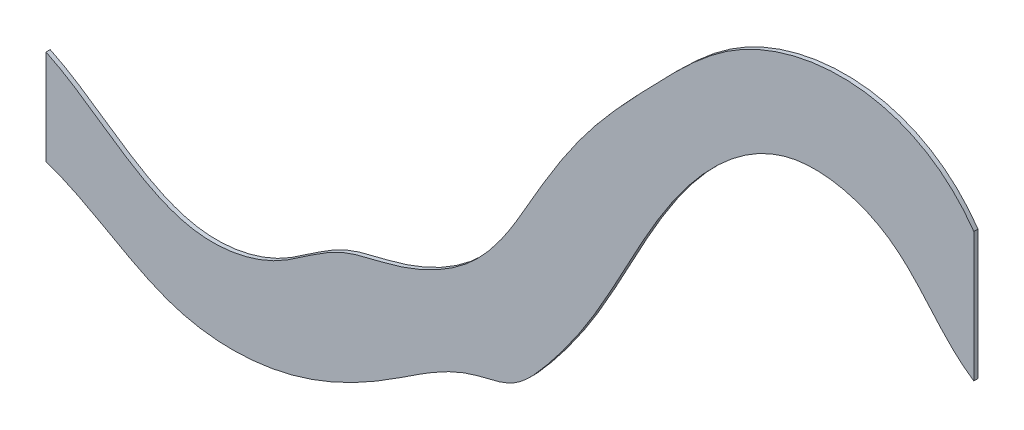
ISO-10303-21;
HEADER;
FILE_DESCRIPTION(('STEP AP214'),'2;1');
FILE_NAME('part.step','',(''),(''),'','','');
FILE_SCHEMA(('AUTOMOTIVE_DESIGN { 1 0 10303 214 1 1 1 1 }'));
ENDSEC;
DATA;
#1=APPLICATION_CONTEXT('core data for automotive mechanical design processes');
#2=APPLICATION_PROTOCOL_DEFINITION('international standard','automotive_design',2000,#1);
#3=PRODUCT_CONTEXT('',#1,'mechanical');
#4=PRODUCT('Part','Part','',(#3));
#5=PRODUCT_RELATED_PRODUCT_CATEGORY('part','',(#4));
#6=PRODUCT_DEFINITION_FORMATION('','',#4);
#7=PRODUCT_DEFINITION_CONTEXT('part definition',#1,'design');
#8=PRODUCT_DEFINITION('design','',#6,#7);
#9=PRODUCT_DEFINITION_SHAPE('','',#8);
#10=(LENGTH_UNIT() NAMED_UNIT(*) SI_UNIT(.MILLI.,.METRE.));
#11=(NAMED_UNIT(*) PLANE_ANGLE_UNIT() SI_UNIT($,.RADIAN.));
#12=(NAMED_UNIT(*) SI_UNIT($,.STERADIAN.) SOLID_ANGLE_UNIT());
#13=UNCERTAINTY_MEASURE_WITH_UNIT(LENGTH_MEASURE(1.E-05),#10,'distance_accuracy_value','');
#14=(GEOMETRIC_REPRESENTATION_CONTEXT(3) GLOBAL_UNCERTAINTY_ASSIGNED_CONTEXT((#13)) GLOBAL_UNIT_ASSIGNED_CONTEXT((#10,
#11,#12)) REPRESENTATION_CONTEXT('',''));
#15=CARTESIAN_POINT('',(0.,0.,0.));
#16=DIRECTION('',(0.,0.,1.));
#17=DIRECTION('',(1.,0.,0.));
#18=AXIS2_PLACEMENT_3D('',#15,#16,#17);
#19=CARTESIAN_POINT('',(0.,55.1181106567383,3.15));
#20=CARTESIAN_POINT('',(34.6121427101227,43.7069613210564,3.15));
#21=CARTESIAN_POINT('',(73.3303461238154,10.9213860851017,3.15));
#22=CARTESIAN_POINT('',(138.606734970731,0.549065405557964,3.15));
#23=CARTESIAN_POINT('',(196.319476745536,7.16149666505087,3.15));
#24=CARTESIAN_POINT('',(258.337648328356,39.3738930449754,3.15));
#25=CARTESIAN_POINT('',(308.016272348858,76.5376579902416,3.15));
#26=CARTESIAN_POINT('',(352.958869797828,82.8450480374583,3.15));
#27=CARTESIAN_POINT('',(381.8820801414,114.584414542399,3.15));
#28=CARTESIAN_POINT('',(416.326078740874,162.597247905456,3.15));
#29=CARTESIAN_POINT('',(449.004695357159,229.005243425656,3.15));
#30=CARTESIAN_POINT('',(491.817782504978,297.145869809272,3.15));
#31=CARTESIAN_POINT('',(557.549192533089,351.024430638699,3.15));
#32=CARTESIAN_POINT('',(648.778173150909,328.642028904199,3.15));
#33=CARTESIAN_POINT('',(675.122566608825,277.992459746102,3.15));
#34=CARTESIAN_POINT('',(700.,261.811012268066,3.15));
#35=B_SPLINE_CURVE_WITH_KNOTS('',3,(#19,#20,#21,#22,#23,#24,#25,#26,#27,#28,#29,#30,#31,#32,#33,
#34),.UNSPECIFIED.,.F.,.F.,(4,1,1,1,1,1,1,1,1,1,1,1,1,4),(0.,0.12488140068535,0.163041618050381,
0.222969139918411,0.319802795673937,0.398409542524113,0.43115817444735,0.468929657142561,
0.538576811722362,0.63546127527961,0.718983692688869,0.816425112264593,0.900124053639158,1.),.UNSPECIFIED.);
#36=DIRECTION('',(0.,0.,-1.));
#37=VECTOR('',#36,1.);
#38=SURFACE_OF_LINEAR_EXTRUSION('',#35,#37);
#39=CARTESIAN_POINT('',(0.,55.1181106567383,0.));
#40=CARTESIAN_POINT('',(34.6121427101227,43.7069613210564,0.));
#41=CARTESIAN_POINT('',(73.3303461238154,10.9213860851017,0.));
#42=CARTESIAN_POINT('',(138.606734970731,0.549065405557964,0.));
#43=CARTESIAN_POINT('',(196.319476745536,7.16149666505087,0.));
#44=CARTESIAN_POINT('',(258.337648328356,39.3738930449754,0.));
#45=CARTESIAN_POINT('',(308.016272348858,76.5376579902416,0.));
#46=CARTESIAN_POINT('',(352.958869797828,82.8450480374583,0.));
#47=CARTESIAN_POINT('',(381.8820801414,114.584414542399,0.));
#48=CARTESIAN_POINT('',(416.326078740874,162.597247905456,0.));
#49=CARTESIAN_POINT('',(449.004695357159,229.005243425656,0.));
#50=CARTESIAN_POINT('',(491.817782504978,297.145869809272,0.));
#51=CARTESIAN_POINT('',(557.549192533089,351.024430638699,0.));
#52=CARTESIAN_POINT('',(648.778173150909,328.642028904199,0.));
#53=CARTESIAN_POINT('',(675.122566608825,277.992459746102,0.));
#54=CARTESIAN_POINT('',(700.,261.811012268066,0.));
#55=B_SPLINE_CURVE_WITH_KNOTS('',3,(#39,#40,#41,#42,#43,#44,#45,#46,#47,#48,#49,#50,#51,#52,#53,
#54),.UNSPECIFIED.,.F.,.F.,(4,1,1,1,1,1,1,1,1,1,1,1,1,4),(0.,0.12488140068535,0.163041618050381,
0.222969139918411,0.319802795673937,0.398409542524113,0.43115817444735,0.468929657142561,
0.538576811722362,0.63546127527961,0.718983692688869,0.816425112264593,0.900124053639158,1.),.UNSPECIFIED.);
#56=CARTESIAN_POINT('',(0.,55.1181106567383,0.));
#57=VERTEX_POINT('',#56);
#58=CARTESIAN_POINT('',(700.,261.811012268066,0.));
#59=VERTEX_POINT('',#58);
#60=EDGE_CURVE('E127',#57,#59,#55,.T.);
#61=ORIENTED_EDGE('',*,*,#60,.T.);
#62=DIRECTION('',(0.,0.,-1.));
#63=VECTOR('',#62,1.);
#64=CARTESIAN_POINT('',(700.,261.811012268066,3.15));
#65=LINE('',#64,#63);
#66=CARTESIAN_POINT('',(700.,261.811012268066,3.15));
#67=VERTEX_POINT('',#66);
#68=EDGE_CURVE('E11',#67,#59,#65,.T.);
#69=ORIENTED_EDGE('',*,*,#68,.F.);
#70=CARTESIAN_POINT('',(0.,55.1181106567383,3.15));
#71=VERTEX_POINT('',#70);
#72=EDGE_CURVE('E92',#71,#67,#35,.T.);
#73=ORIENTED_EDGE('',*,*,#72,.F.);
#74=DIRECTION('',(0.,0.,-1.));
#75=VECTOR('',#74,1.);
#76=CARTESIAN_POINT('',(0.,55.1181106567383,3.15));
#77=LINE('',#76,#75);
#78=EDGE_CURVE('E104',#71,#57,#77,.T.);
#79=ORIENTED_EDGE('',*,*,#78,.T.);
#80=EDGE_LOOP('',(#61,#69,#73,#79));
#81=FACE_BOUND('',#80,.T.);
#82=ADVANCED_FACE('F39',(#81),#38,.F.);
#83=CARTESIAN_POINT('',(700.,359.520408358605,3.15));
#84=DIRECTION('',(-1.,0.,0.));
#85=DIRECTION('',(0.,0.,1.));
#86=AXIS2_PLACEMENT_3D('',#83,#84,#85);
#87=PLANE('',#86);
#88=DIRECTION('',(0.,1.,0.));
#89=VECTOR('',#88,1.);
#90=CARTESIAN_POINT('',(700.,359.520408358605,0.));
#91=LINE('',#90,#89);
#92=CARTESIAN_POINT('',(700.,359.520408358605,0.));
#93=VERTEX_POINT('',#92);
#94=EDGE_CURVE('E97',#59,#93,#91,.T.);
#95=ORIENTED_EDGE('',*,*,#94,.T.);
#96=DIRECTION('',(0.,0.,-1.));
#97=VECTOR('',#96,1.);
#98=CARTESIAN_POINT('',(700.,359.520408358605,3.15));
#99=LINE('',#98,#97);
#100=CARTESIAN_POINT('',(700.,359.520408358605,3.15));
#101=VERTEX_POINT('',#100);
#102=EDGE_CURVE('E49',#101,#93,#99,.T.);
#103=ORIENTED_EDGE('',*,*,#102,.F.);
#104=DIRECTION('',(0.,1.,0.));
#105=VECTOR('',#104,1.);
#106=CARTESIAN_POINT('',(700.,359.520408358605,3.15));
#107=LINE('',#106,#105);
#108=EDGE_CURVE('E87',#67,#101,#107,.T.);
#109=ORIENTED_EDGE('',*,*,#108,.F.);
#110=ORIENTED_EDGE('',*,*,#68,.T.);
#111=EDGE_LOOP('',(#95,#103,#109,#110));
#112=FACE_BOUND('',#111,.T.);
#113=ADVANCED_FACE('F96',(#112),#87,.F.);
#114=CARTESIAN_POINT('',(700.,359.520408358605,3.15));
#115=CARTESIAN_POINT('',(656.844390566634,421.56987410297,3.15));
#116=CARTESIAN_POINT('',(543.77058435758,421.891252928594,3.15));
#117=CARTESIAN_POINT('',(461.425766556773,337.636443170338,3.15));
#118=CARTESIAN_POINT('',(409.749423056251,283.691808510049,3.15));
#119=CARTESIAN_POINT('',(368.165525930033,219.113681048021,3.15));
#120=CARTESIAN_POINT('',(332.710130464585,150.060180225757,3.15));
#121=CARTESIAN_POINT('',(271.877088044145,118.463779099621,3.15));
#122=CARTESIAN_POINT('',(215.817824143393,109.527507408997,3.15));
#123=CARTESIAN_POINT('',(175.685138732165,71.6284103331284,3.15));
#124=CARTESIAN_POINT('',(87.5085155178419,54.2139868290071,3.15));
#125=CARTESIAN_POINT('',(36.3807558593942,109.76749435277,3.15));
#126=CARTESIAN_POINT('',(0.,126.771659851074,3.15));
#127=B_SPLINE_CURVE_WITH_KNOTS('',3,(#114,#115,#116,#117,#118,#119,#120,#121,#122,#123,#124,
#125,#126),.UNSPECIFIED.,.F.,.F.,(4,1,1,1,1,1,1,1,1,1,4),(0.,0.225398540435107,
0.318231423295847,0.404161036345138,0.484762606498662,0.585751485566438,0.665781609173071,
0.712280382254172,0.77964836561405,0.851058294438362,1.),.UNSPECIFIED.);
#128=DIRECTION('',(0.,0.,-1.));
#129=VECTOR('',#128,1.);
#130=SURFACE_OF_LINEAR_EXTRUSION('',#127,#129);
#131=CARTESIAN_POINT('',(700.,359.520408358605,0.));
#132=CARTESIAN_POINT('',(656.844390566634,421.56987410297,0.));
#133=CARTESIAN_POINT('',(543.77058435758,421.891252928594,0.));
#134=CARTESIAN_POINT('',(461.425766556773,337.636443170338,0.));
#135=CARTESIAN_POINT('',(409.749423056251,283.691808510049,0.));
#136=CARTESIAN_POINT('',(368.165525930033,219.113681048021,0.));
#137=CARTESIAN_POINT('',(332.710130464585,150.060180225757,0.));
#138=CARTESIAN_POINT('',(271.877088044145,118.463779099621,0.));
#139=CARTESIAN_POINT('',(215.817824143393,109.527507408997,0.));
#140=CARTESIAN_POINT('',(175.685138732165,71.6284103331284,0.));
#141=CARTESIAN_POINT('',(87.5085155178419,54.2139868290071,0.));
#142=CARTESIAN_POINT('',(36.3807558593942,109.76749435277,0.));
#143=CARTESIAN_POINT('',(0.,126.771659851074,0.));
#144=B_SPLINE_CURVE_WITH_KNOTS('',3,(#131,#132,#133,#134,#135,#136,#137,#138,#139,#140,#141,
#142,#143),.UNSPECIFIED.,.F.,.F.,(4,1,1,1,1,1,1,1,1,1,4),(0.,0.225398540435107,
0.318231423295847,0.404161036345138,0.484762606498662,0.585751485566438,0.665781609173071,
0.712280382254172,0.77964836561405,0.851058294438362,1.),.UNSPECIFIED.);
#145=CARTESIAN_POINT('',(0.,126.771659851074,0.));
#146=VERTEX_POINT('',#145);
#147=EDGE_CURVE('E74',#93,#146,#144,.T.);
#148=ORIENTED_EDGE('',*,*,#147,.T.);
#149=DIRECTION('',(0.,0.,-1.));
#150=VECTOR('',#149,1.);
#151=CARTESIAN_POINT('',(0.,126.771659851074,3.15));
#152=LINE('',#151,#150);
#153=CARTESIAN_POINT('',(0.,126.771659851074,3.15));
#154=VERTEX_POINT('',#153);
#155=EDGE_CURVE('E99',#154,#146,#152,.T.);
#156=ORIENTED_EDGE('',*,*,#155,.F.);
#157=EDGE_CURVE('E90',#101,#154,#127,.T.);
#158=ORIENTED_EDGE('',*,*,#157,.F.);
#159=ORIENTED_EDGE('',*,*,#102,.T.);
#160=EDGE_LOOP('',(#148,#156,#158,#159));
#161=FACE_BOUND('',#160,.T.);
#162=ADVANCED_FACE('F100',(#161),#130,.F.);
#163=CARTESIAN_POINT('',(0.,55.1181106567383,3.15));
#164=DIRECTION('',(1.,0.,0.));
#165=DIRECTION('',(0.,0.,-1.));
#166=AXIS2_PLACEMENT_3D('',#163,#164,#165);
#167=PLANE('',#166);
#168=DIRECTION('',(0.,-1.,0.));
#169=VECTOR('',#168,1.);
#170=CARTESIAN_POINT('',(0.,55.1181106567383,0.));
#171=LINE('',#170,#169);
#172=EDGE_CURVE('E80',#146,#57,#171,.T.);
#173=ORIENTED_EDGE('',*,*,#172,.T.);
#174=ORIENTED_EDGE('',*,*,#78,.F.);
#175=DIRECTION('',(0.,-1.,0.));
#176=VECTOR('',#175,1.);
#177=CARTESIAN_POINT('',(0.,55.1181106567383,3.15));
#178=LINE('',#177,#176);
#179=EDGE_CURVE('E57',#154,#71,#178,.T.);
#180=ORIENTED_EDGE('',*,*,#179,.F.);
#181=ORIENTED_EDGE('',*,*,#155,.T.);
#182=EDGE_LOOP('',(#173,#174,#180,#181));
#183=FACE_BOUND('',#182,.T.);
#184=ADVANCED_FACE('F116',(#183),#167,.F.);
#185=CARTESIAN_POINT('',(391.835025499638,129.143504226111,3.15));
#186=DIRECTION('',(0.,0.,1.));
#187=DIRECTION('',(1.,0.,0.));
#188=AXIS2_PLACEMENT_3D('',#185,#186,#187);
#189=PLANE('',#188);
#190=ORIENTED_EDGE('',*,*,#72,.T.);
#191=ORIENTED_EDGE('',*,*,#108,.T.);
#192=ORIENTED_EDGE('',*,*,#157,.T.);
#193=ORIENTED_EDGE('',*,*,#179,.T.);
#194=EDGE_LOOP('',(#190,#191,#192,#193));
#195=FACE_BOUND('',#194,.T.);
#196=ADVANCED_FACE('F88',(#195),#189,.T.);
#197=CARTESIAN_POINT('',(391.835025499638,129.143504226111,0.));
#198=DIRECTION('',(0.,0.,1.));
#199=DIRECTION('',(1.,0.,0.));
#200=AXIS2_PLACEMENT_3D('',#197,#198,#199);
#201=PLANE('',#200);
#202=ORIENTED_EDGE('',*,*,#60,.F.);
#203=ORIENTED_EDGE('',*,*,#172,.F.);
#204=ORIENTED_EDGE('',*,*,#147,.F.);
#205=ORIENTED_EDGE('',*,*,#94,.F.);
#206=EDGE_LOOP('',(#202,#203,#204,#205));
#207=FACE_BOUND('',#206,.T.);
#208=ADVANCED_FACE('F150',(#207),#201,.F.);
#209=CLOSED_SHELL('',(#82,#113,#162,#184,#196,#208));
#210=MANIFOLD_SOLID_BREP('B2',#209);
#211=ADVANCED_BREP_SHAPE_REPRESENTATION('',(#18,#210),#14);
#212=SHAPE_DEFINITION_REPRESENTATION(#9,#211);
ENDSEC;
END-ISO-10303-21;
